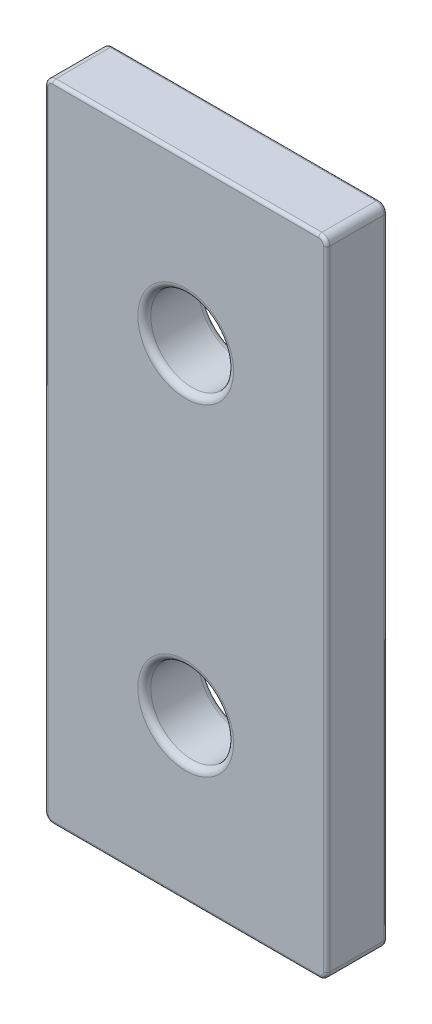
ISO-10303-21;
HEADER;
FILE_DESCRIPTION(('STEP AP214'),'2;1');
FILE_NAME('part.step','',(''),(''),'','','');
FILE_SCHEMA(('AUTOMOTIVE_DESIGN { 1 0 10303 214 1 1 1 1 }'));
ENDSEC;
DATA;
#1=APPLICATION_CONTEXT('core data for automotive mechanical design processes');
#2=APPLICATION_PROTOCOL_DEFINITION('international standard','automotive_design',2000,#1);
#3=PRODUCT_CONTEXT('',#1,'mechanical');
#4=PRODUCT('Part','Part','',(#3));
#5=PRODUCT_RELATED_PRODUCT_CATEGORY('part','',(#4));
#6=PRODUCT_DEFINITION_FORMATION('','',#4);
#7=PRODUCT_DEFINITION_CONTEXT('part definition',#1,'design');
#8=PRODUCT_DEFINITION('design','',#6,#7);
#9=PRODUCT_DEFINITION_SHAPE('','',#8);
#10=(LENGTH_UNIT() NAMED_UNIT(*) SI_UNIT(.MILLI.,.METRE.));
#11=(NAMED_UNIT(*) PLANE_ANGLE_UNIT() SI_UNIT($,.RADIAN.));
#12=(NAMED_UNIT(*) SI_UNIT($,.STERADIAN.) SOLID_ANGLE_UNIT());
#13=UNCERTAINTY_MEASURE_WITH_UNIT(LENGTH_MEASURE(1.E-05),#10,'distance_accuracy_value','');
#14=(GEOMETRIC_REPRESENTATION_CONTEXT(3) GLOBAL_UNCERTAINTY_ASSIGNED_CONTEXT((#13)) GLOBAL_UNIT_ASSIGNED_CONTEXT((#10,
#11,#12)) REPRESENTATION_CONTEXT('',''));
#15=CARTESIAN_POINT('',(0.,0.,0.));
#16=DIRECTION('',(0.,0.,1.));
#17=DIRECTION('',(1.,0.,0.));
#18=AXIS2_PLACEMENT_3D('',#15,#16,#17);
#19=CARTESIAN_POINT('',(-11.1125,25.4,2.3876));
#20=DIRECTION('',(0.,-1.,0.));
#21=DIRECTION('',(0.,0.,-1.));
#22=AXIS2_PLACEMENT_3D('',#19,#20,#21);
#23=PLANE('',#22);
#24=DIRECTION('',(0.,0.,-1.));
#25=VECTOR('',#24,1.);
#26=CARTESIAN_POINT('',(10.4775,25.4,2.3876));
#27=LINE('',#26,#25);
#28=CARTESIAN_POINT('',(10.4775,25.4,2.1336));
#29=VERTEX_POINT('',#28);
#30=CARTESIAN_POINT('',(10.4775,25.4,-2.1336));
#31=VERTEX_POINT('',#30);
#32=EDGE_CURVE('E190',#29,#31,#27,.T.);
#33=ORIENTED_EDGE('',*,*,#32,.T.);
#34=DIRECTION('',(-1.,0.,0.));
#35=VECTOR('',#34,1.);
#36=CARTESIAN_POINT('',(-10.4775,25.4,-2.1336));
#37=LINE('',#36,#35);
#38=CARTESIAN_POINT('',(-10.4775,25.4,-2.1336));
#39=VERTEX_POINT('',#38);
#40=EDGE_CURVE('E246',#31,#39,#37,.T.);
#41=ORIENTED_EDGE('',*,*,#40,.T.);
#42=DIRECTION('',(0.,0.,-1.));
#43=VECTOR('',#42,1.);
#44=CARTESIAN_POINT('',(-10.4775,25.4,2.3876));
#45=LINE('',#44,#43);
#46=CARTESIAN_POINT('',(-10.4775,25.4,2.1336));
#47=VERTEX_POINT('',#46);
#48=EDGE_CURVE('E185',#39,#47,#45,.F.);
#49=ORIENTED_EDGE('',*,*,#48,.T.);
#50=DIRECTION('',(-1.,0.,0.));
#51=VECTOR('',#50,1.);
#52=CARTESIAN_POINT('',(-11.1125,25.4,2.1336));
#53=LINE('',#52,#51);
#54=EDGE_CURVE('E243',#47,#29,#53,.F.);
#55=ORIENTED_EDGE('',*,*,#54,.T.);
#56=EDGE_LOOP('',(#33,#41,#49,#55));
#57=FACE_BOUND('',#56,.T.);
#58=ADVANCED_FACE('F43',(#57),#23,.F.);
#59=CARTESIAN_POINT('',(-11.1125,25.4,2.3876));
#60=DIRECTION('',(1.,0.,0.));
#61=DIRECTION('',(0.,0.,-1.));
#62=AXIS2_PLACEMENT_3D('',#59,#60,#61);
#63=PLANE('',#62);
#64=DIRECTION('',(0.,0.,-1.));
#65=VECTOR('',#64,1.);
#66=CARTESIAN_POINT('',(-11.1125,24.765,2.3876));
#67=LINE('',#66,#65);
#68=CARTESIAN_POINT('',(-11.1125,24.765,2.1336));
#69=VERTEX_POINT('',#68);
#70=CARTESIAN_POINT('',(-11.1125,24.765,-2.1336));
#71=VERTEX_POINT('',#70);
#72=EDGE_CURVE('E532',#69,#71,#67,.T.);
#73=ORIENTED_EDGE('',*,*,#72,.T.);
#74=DIRECTION('',(0.,-1.,0.));
#75=VECTOR('',#74,1.);
#76=CARTESIAN_POINT('',(-11.1125,-24.765,-2.1336));
#77=LINE('',#76,#75);
#78=CARTESIAN_POINT('',(-11.1125,-24.765,-2.1336));
#79=VERTEX_POINT('',#78);
#80=EDGE_CURVE('E234',#71,#79,#77,.T.);
#81=ORIENTED_EDGE('',*,*,#80,.T.);
#82=DIRECTION('',(0.,0.,-1.));
#83=VECTOR('',#82,1.);
#84=CARTESIAN_POINT('',(-11.1125,-24.765,2.3876));
#85=LINE('',#84,#83);
#86=CARTESIAN_POINT('',(-11.1125,-24.765,2.1336));
#87=VERTEX_POINT('',#86);
#88=EDGE_CURVE('E536',#79,#87,#85,.F.);
#89=ORIENTED_EDGE('',*,*,#88,.T.);
#90=DIRECTION('',(0.,-1.,0.));
#91=VECTOR('',#90,1.);
#92=CARTESIAN_POINT('',(-11.1125,25.4,2.1336));
#93=LINE('',#92,#91);
#94=EDGE_CURVE('E231',#87,#69,#93,.F.);
#95=ORIENTED_EDGE('',*,*,#94,.T.);
#96=EDGE_LOOP('',(#73,#81,#89,#95));
#97=FACE_BOUND('',#96,.T.);
#98=ADVANCED_FACE('F387',(#97),#63,.F.);
#99=CARTESIAN_POINT('',(-11.1125,-25.4,2.3876));
#100=DIRECTION('',(0.,1.,0.));
#101=DIRECTION('',(0.,0.,1.));
#102=AXIS2_PLACEMENT_3D('',#99,#100,#101);
#103=PLANE('',#102);
#104=DIRECTION('',(0.,0.,-1.));
#105=VECTOR('',#104,1.);
#106=CARTESIAN_POINT('',(-10.4775,-25.4,2.3876));
#107=LINE('',#106,#105);
#108=CARTESIAN_POINT('',(-10.4775,-25.4,2.1336));
#109=VERTEX_POINT('',#108);
#110=CARTESIAN_POINT('',(-10.4775,-25.4,-2.1336));
#111=VERTEX_POINT('',#110);
#112=EDGE_CURVE('E502',#109,#111,#107,.T.);
#113=ORIENTED_EDGE('',*,*,#112,.T.);
#114=DIRECTION('',(1.,0.,0.));
#115=VECTOR('',#114,1.);
#116=CARTESIAN_POINT('',(10.4775,-25.4,-2.1336));
#117=LINE('',#116,#115);
#118=CARTESIAN_POINT('',(10.4775,-25.4,-2.1336));
#119=VERTEX_POINT('',#118);
#120=EDGE_CURVE('E222',#111,#119,#117,.T.);
#121=ORIENTED_EDGE('',*,*,#120,.T.);
#122=DIRECTION('',(0.,0.,-1.));
#123=VECTOR('',#122,1.);
#124=CARTESIAN_POINT('',(10.4775,-25.4,2.3876));
#125=LINE('',#124,#123);
#126=CARTESIAN_POINT('',(10.4775,-25.4,2.1336));
#127=VERTEX_POINT('',#126);
#128=EDGE_CURVE('E510',#119,#127,#125,.F.);
#129=ORIENTED_EDGE('',*,*,#128,.T.);
#130=DIRECTION('',(1.,0.,0.));
#131=VECTOR('',#130,1.);
#132=CARTESIAN_POINT('',(-11.1125,-25.4,2.1336));
#133=LINE('',#132,#131);
#134=EDGE_CURVE('E219',#127,#109,#133,.F.);
#135=ORIENTED_EDGE('',*,*,#134,.T.);
#136=EDGE_LOOP('',(#113,#121,#129,#135));
#137=FACE_BOUND('',#136,.T.);
#138=ADVANCED_FACE('F393',(#137),#103,.F.);
#139=CARTESIAN_POINT('',(11.1125,25.4,2.3876));
#140=DIRECTION('',(-1.,0.,0.));
#141=DIRECTION('',(0.,0.,1.));
#142=AXIS2_PLACEMENT_3D('',#139,#140,#141);
#143=PLANE('',#142);
#144=DIRECTION('',(0.,0.,-1.));
#145=VECTOR('',#144,1.);
#146=CARTESIAN_POINT('',(11.1125,-24.765,2.3876));
#147=LINE('',#146,#145);
#148=CARTESIAN_POINT('',(11.1125,-24.765,2.1336));
#149=VERTEX_POINT('',#148);
#150=CARTESIAN_POINT('',(11.1125,-24.765,-2.1336));
#151=VERTEX_POINT('',#150);
#152=EDGE_CURVE('E511',#149,#151,#147,.T.);
#153=ORIENTED_EDGE('',*,*,#152,.T.);
#154=DIRECTION('',(0.,1.,0.));
#155=VECTOR('',#154,1.);
#156=CARTESIAN_POINT('',(11.1125,24.765,-2.1336));
#157=LINE('',#156,#155);
#158=CARTESIAN_POINT('',(11.1125,24.765,-2.1336));
#159=VERTEX_POINT('',#158);
#160=EDGE_CURVE('E279',#151,#159,#157,.T.);
#161=ORIENTED_EDGE('',*,*,#160,.T.);
#162=DIRECTION('',(0.,0.,-1.));
#163=VECTOR('',#162,1.);
#164=CARTESIAN_POINT('',(11.1125,24.765,2.3876));
#165=LINE('',#164,#163);
#166=CARTESIAN_POINT('',(11.1125,24.765,2.1336));
#167=VERTEX_POINT('',#166);
#168=EDGE_CURVE('E306',#159,#167,#165,.F.);
#169=ORIENTED_EDGE('',*,*,#168,.T.);
#170=DIRECTION('',(0.,1.,0.));
#171=VECTOR('',#170,1.);
#172=CARTESIAN_POINT('',(11.1125,25.4,2.1336));
#173=LINE('',#172,#171);
#174=EDGE_CURVE('E276',#167,#149,#173,.F.);
#175=ORIENTED_EDGE('',*,*,#174,.T.);
#176=EDGE_LOOP('',(#153,#161,#169,#175));
#177=FACE_BOUND('',#176,.T.);
#178=ADVANCED_FACE('F486',(#177),#143,.F.);
#179=CARTESIAN_POINT('',(0.,0.,2.3876));
#180=DIRECTION('',(0.,0.,-1.));
#181=DIRECTION('',(-1.,0.,0.));
#182=AXIS2_PLACEMENT_3D('',#179,#180,#181);
#183=PLANE('',#182);
#184=CARTESIAN_POINT('',(0.,12.7,2.3876));
#185=DIRECTION('',(0.,0.,-1.));
#186=DIRECTION('',(-1.,0.,0.));
#187=AXIS2_PLACEMENT_3D('',#184,#185,#186);
#188=CIRCLE('',#187,3.7719);
#189=CARTESIAN_POINT('',(-3.7719,12.7,2.3876));
#190=VERTEX_POINT('',#189);
#191=EDGE_CURVE('E11',#190,#190,#188,.T.);
#192=ORIENTED_EDGE('',*,*,#191,.T.);
#193=EDGE_LOOP('',(#192));
#194=FACE_BOUND('',#193,.T.);
#195=CARTESIAN_POINT('',(0.,-12.7,2.3876));
#196=DIRECTION('',(0.,0.,-1.));
#197=DIRECTION('',(-1.,0.,0.));
#198=AXIS2_PLACEMENT_3D('',#195,#196,#197);
#199=CIRCLE('',#198,3.7719);
#200=CARTESIAN_POINT('',(-3.7719,-12.7,2.3876));
#201=VERTEX_POINT('',#200);
#202=EDGE_CURVE('E52',#201,#201,#199,.T.);
#203=ORIENTED_EDGE('',*,*,#202,.T.);
#204=EDGE_LOOP('',(#203));
#205=FACE_BOUND('',#204,.T.);
#206=DIRECTION('',(1.,0.,0.));
#207=VECTOR('',#206,1.);
#208=CARTESIAN_POINT('',(0.,-25.146,2.3876));
#209=LINE('',#208,#207);
#210=CARTESIAN_POINT('',(-10.4775,-25.146,2.3876));
#211=VERTEX_POINT('',#210);
#212=CARTESIAN_POINT('',(10.4775,-25.146,2.3876));
#213=VERTEX_POINT('',#212);
#214=EDGE_CURVE('E59',#211,#213,#209,.T.);
#215=ORIENTED_EDGE('',*,*,#214,.T.);
#216=CARTESIAN_POINT('',(10.4775,-24.765,2.3876));
#217=DIRECTION('',(0.,0.,-1.));
#218=DIRECTION('',(-1.,0.,0.));
#219=AXIS2_PLACEMENT_3D('',#216,#217,#218);
#220=CIRCLE('',#219,0.381);
#221=CARTESIAN_POINT('',(10.8585,-24.765,2.3876));
#222=VERTEX_POINT('',#221);
#223=EDGE_CURVE('E273',#213,#222,#220,.F.);
#224=ORIENTED_EDGE('',*,*,#223,.T.);
#225=DIRECTION('',(0.,1.,0.));
#226=VECTOR('',#225,1.);
#227=CARTESIAN_POINT('',(10.8585,0.,2.3876));
#228=LINE('',#227,#226);
#229=CARTESIAN_POINT('',(10.8585,24.765,2.3876));
#230=VERTEX_POINT('',#229);
#231=EDGE_CURVE('E254',#222,#230,#228,.T.);
#232=ORIENTED_EDGE('',*,*,#231,.T.);
#233=CARTESIAN_POINT('',(10.4775,24.765,2.3876));
#234=DIRECTION('',(0.,0.,-1.));
#235=DIRECTION('',(-1.,0.,0.));
#236=AXIS2_PLACEMENT_3D('',#233,#234,#235);
#237=CIRCLE('',#236,0.381);
#238=CARTESIAN_POINT('',(10.4775,25.146,2.3876));
#239=VERTEX_POINT('',#238);
#240=EDGE_CURVE('E257',#230,#239,#237,.F.);
#241=ORIENTED_EDGE('',*,*,#240,.T.);
#242=DIRECTION('',(-1.,0.,0.));
#243=VECTOR('',#242,1.);
#244=CARTESIAN_POINT('',(0.,25.146,2.3876));
#245=LINE('',#244,#243);
#246=CARTESIAN_POINT('',(-10.4775,25.146,2.3876));
#247=VERTEX_POINT('',#246);
#248=EDGE_CURVE('E260',#239,#247,#245,.T.);
#249=ORIENTED_EDGE('',*,*,#248,.T.);
#250=CARTESIAN_POINT('',(-10.4775,24.765,2.3876));
#251=DIRECTION('',(0.,0.,-1.));
#252=DIRECTION('',(-1.,0.,0.));
#253=AXIS2_PLACEMENT_3D('',#250,#251,#252);
#254=CIRCLE('',#253,0.381);
#255=CARTESIAN_POINT('',(-10.8585,24.765,2.3876));
#256=VERTEX_POINT('',#255);
#257=EDGE_CURVE('E263',#247,#256,#254,.F.);
#258=ORIENTED_EDGE('',*,*,#257,.T.);
#259=DIRECTION('',(0.,-1.,0.));
#260=VECTOR('',#259,1.);
#261=CARTESIAN_POINT('',(-10.8585,0.,2.3876));
#262=LINE('',#261,#260);
#263=CARTESIAN_POINT('',(-10.8585,-24.765,2.3876));
#264=VERTEX_POINT('',#263);
#265=EDGE_CURVE('E266',#256,#264,#262,.T.);
#266=ORIENTED_EDGE('',*,*,#265,.T.);
#267=CARTESIAN_POINT('',(-10.4775,-24.765,2.3876));
#268=DIRECTION('',(0.,0.,-1.));
#269=DIRECTION('',(-1.,0.,0.));
#270=AXIS2_PLACEMENT_3D('',#267,#268,#269);
#271=CIRCLE('',#270,0.381);
#272=EDGE_CURVE('E64',#264,#211,#271,.F.);
#273=ORIENTED_EDGE('',*,*,#272,.T.);
#274=EDGE_LOOP('',(#215,#224,#232,#241,#249,#258,#266,#273));
#275=FACE_BOUND('',#274,.T.);
#276=ADVANCED_FACE('F363',(#194,#205,#275),#183,.F.);
#277=CARTESIAN_POINT('',(0.,0.,-2.3876));
#278=DIRECTION('',(0.,0.,-1.));
#279=DIRECTION('',(-1.,0.,0.));
#280=AXIS2_PLACEMENT_3D('',#277,#278,#279);
#281=PLANE('',#280);
#282=CARTESIAN_POINT('',(0.,12.7,-2.3876));
#283=DIRECTION('',(0.,0.,-1.));
#284=DIRECTION('',(-1.,0.,0.));
#285=AXIS2_PLACEMENT_3D('',#282,#283,#284);
#286=CIRCLE('',#285,3.7719);
#287=CARTESIAN_POINT('',(-3.7719,12.7,-2.3876));
#288=VERTEX_POINT('',#287);
#289=EDGE_CURVE('E339',#288,#288,#286,.F.);
#290=ORIENTED_EDGE('',*,*,#289,.T.);
#291=EDGE_LOOP('',(#290));
#292=FACE_BOUND('',#291,.T.);
#293=CARTESIAN_POINT('',(0.,-12.7,-2.3876));
#294=DIRECTION('',(0.,0.,-1.));
#295=DIRECTION('',(-1.,0.,0.));
#296=AXIS2_PLACEMENT_3D('',#293,#294,#295);
#297=CIRCLE('',#296,3.7719);
#298=CARTESIAN_POINT('',(-3.7719,-12.7,-2.3876));
#299=VERTEX_POINT('',#298);
#300=EDGE_CURVE('E282',#299,#299,#297,.F.);
#301=ORIENTED_EDGE('',*,*,#300,.T.);
#302=EDGE_LOOP('',(#301));
#303=FACE_BOUND('',#302,.T.);
#304=DIRECTION('',(0.,1.,0.));
#305=VECTOR('',#304,1.);
#306=CARTESIAN_POINT('',(10.8585,-24.765,-2.3876));
#307=LINE('',#306,#305);
#308=CARTESIAN_POINT('',(10.8585,24.765,-2.3876));
#309=VERTEX_POINT('',#308);
#310=CARTESIAN_POINT('',(10.8585,-24.765,-2.3876));
#311=VERTEX_POINT('',#310);
#312=EDGE_CURVE('E161',#309,#311,#307,.F.);
#313=ORIENTED_EDGE('',*,*,#312,.T.);
#314=CARTESIAN_POINT('',(10.4775,-24.765,-2.3876));
#315=DIRECTION('',(0.,0.,-1.));
#316=DIRECTION('',(-1.,0.,0.));
#317=AXIS2_PLACEMENT_3D('',#314,#315,#316);
#318=CIRCLE('',#317,0.381);
#319=CARTESIAN_POINT('',(10.4775,-25.146,-2.3876));
#320=VERTEX_POINT('',#319);
#321=EDGE_CURVE('E208',#311,#320,#318,.T.);
#322=ORIENTED_EDGE('',*,*,#321,.T.);
#323=DIRECTION('',(1.,0.,0.));
#324=VECTOR('',#323,1.);
#325=CARTESIAN_POINT('',(-10.4775,-25.146,-2.3876));
#326=LINE('',#325,#324);
#327=CARTESIAN_POINT('',(-10.4775,-25.146,-2.3876));
#328=VERTEX_POINT('',#327);
#329=EDGE_CURVE('E205',#320,#328,#326,.F.);
#330=ORIENTED_EDGE('',*,*,#329,.T.);
#331=CARTESIAN_POINT('',(-10.4775,-24.765,-2.3876));
#332=DIRECTION('',(0.,0.,-1.));
#333=DIRECTION('',(-1.,0.,0.));
#334=AXIS2_PLACEMENT_3D('',#331,#332,#333);
#335=CIRCLE('',#334,0.381);
#336=CARTESIAN_POINT('',(-10.8585,-24.765,-2.3876));
#337=VERTEX_POINT('',#336);
#338=EDGE_CURVE('E202',#328,#337,#335,.T.);
#339=ORIENTED_EDGE('',*,*,#338,.T.);
#340=DIRECTION('',(0.,-1.,0.));
#341=VECTOR('',#340,1.);
#342=CARTESIAN_POINT('',(-10.8585,24.765,-2.3876));
#343=LINE('',#342,#341);
#344=CARTESIAN_POINT('',(-10.8585,24.765,-2.3876));
#345=VERTEX_POINT('',#344);
#346=EDGE_CURVE('E199',#337,#345,#343,.F.);
#347=ORIENTED_EDGE('',*,*,#346,.T.);
#348=CARTESIAN_POINT('',(-10.4775,24.765,-2.3876));
#349=DIRECTION('',(0.,0.,-1.));
#350=DIRECTION('',(-1.,0.,0.));
#351=AXIS2_PLACEMENT_3D('',#348,#349,#350);
#352=CIRCLE('',#351,0.381);
#353=CARTESIAN_POINT('',(-10.4775,25.146,-2.3876));
#354=VERTEX_POINT('',#353);
#355=EDGE_CURVE('E196',#345,#354,#352,.T.);
#356=ORIENTED_EDGE('',*,*,#355,.T.);
#357=DIRECTION('',(-1.,0.,0.));
#358=VECTOR('',#357,1.);
#359=CARTESIAN_POINT('',(10.4775,25.146,-2.3876));
#360=LINE('',#359,#358);
#361=CARTESIAN_POINT('',(10.4775,25.146,-2.3876));
#362=VERTEX_POINT('',#361);
#363=EDGE_CURVE('E164',#354,#362,#360,.F.);
#364=ORIENTED_EDGE('',*,*,#363,.T.);
#365=CARTESIAN_POINT('',(10.4775,24.765,-2.3876));
#366=DIRECTION('',(0.,0.,-1.));
#367=DIRECTION('',(-1.,0.,0.));
#368=AXIS2_PLACEMENT_3D('',#365,#366,#367);
#369=CIRCLE('',#368,0.381);
#370=EDGE_CURVE('E156',#362,#309,#369,.T.);
#371=ORIENTED_EDGE('',*,*,#370,.T.);
#372=EDGE_LOOP('',(#313,#322,#330,#339,#347,#356,#364,#371));
#373=FACE_BOUND('',#372,.T.);
#374=ADVANCED_FACE('F158',(#292,#303,#373),#281,.T.);
#375=CARTESIAN_POINT('',(10.4775,-24.765,2.3876));
#376=DIRECTION('',(0.,0.,-1.));
#377=DIRECTION('',(-1.,0.,0.));
#378=AXIS2_PLACEMENT_3D('',#375,#376,#377);
#379=CYLINDRICAL_SURFACE('',#378,0.635);
#380=ORIENTED_EDGE('',*,*,#128,.F.);
#381=CARTESIAN_POINT('',(10.4775,-24.765,-2.1336));
#382=DIRECTION('',(0.,0.,-1.));
#383=DIRECTION('',(-1.,0.,0.));
#384=AXIS2_PLACEMENT_3D('',#381,#382,#383);
#385=CIRCLE('',#384,0.635);
#386=EDGE_CURVE('E215',#119,#151,#385,.F.);
#387=ORIENTED_EDGE('',*,*,#386,.T.);
#388=ORIENTED_EDGE('',*,*,#152,.F.);
#389=CARTESIAN_POINT('',(10.4775,-24.765,2.1336));
#390=DIRECTION('',(0.,0.,-1.));
#391=DIRECTION('',(-1.,0.,0.));
#392=AXIS2_PLACEMENT_3D('',#389,#390,#391);
#393=CIRCLE('',#392,0.635);
#394=EDGE_CURVE('E211',#149,#127,#393,.T.);
#395=ORIENTED_EDGE('',*,*,#394,.T.);
#396=EDGE_LOOP('',(#380,#387,#388,#395));
#397=FACE_BOUND('',#396,.T.);
#398=ADVANCED_FACE('F399',(#397),#379,.T.);
#399=CARTESIAN_POINT('',(-10.4775,-24.765,2.3876));
#400=DIRECTION('',(0.,0.,-1.));
#401=DIRECTION('',(-1.,0.,0.));
#402=AXIS2_PLACEMENT_3D('',#399,#400,#401);
#403=CYLINDRICAL_SURFACE('',#402,0.635);
#404=ORIENTED_EDGE('',*,*,#88,.F.);
#405=CARTESIAN_POINT('',(-10.4775,-24.765,-2.1336));
#406=DIRECTION('',(0.,0.,-1.));
#407=DIRECTION('',(-1.,0.,0.));
#408=AXIS2_PLACEMENT_3D('',#405,#406,#407);
#409=CIRCLE('',#408,0.635);
#410=EDGE_CURVE('E228',#79,#111,#409,.F.);
#411=ORIENTED_EDGE('',*,*,#410,.T.);
#412=ORIENTED_EDGE('',*,*,#112,.F.);
#413=CARTESIAN_POINT('',(-10.4775,-24.765,2.1336));
#414=DIRECTION('',(0.,0.,-1.));
#415=DIRECTION('',(-1.,0.,0.));
#416=AXIS2_PLACEMENT_3D('',#413,#414,#415);
#417=CIRCLE('',#416,0.635);
#418=EDGE_CURVE('E225',#109,#87,#417,.T.);
#419=ORIENTED_EDGE('',*,*,#418,.T.);
#420=EDGE_LOOP('',(#404,#411,#412,#419));
#421=FACE_BOUND('',#420,.T.);
#422=ADVANCED_FACE('F402',(#421),#403,.T.);
#423=CARTESIAN_POINT('',(-10.4775,24.765,2.3876));
#424=DIRECTION('',(0.,0.,-1.));
#425=DIRECTION('',(-1.,0.,0.));
#426=AXIS2_PLACEMENT_3D('',#423,#424,#425);
#427=CYLINDRICAL_SURFACE('',#426,0.635);
#428=ORIENTED_EDGE('',*,*,#48,.F.);
#429=CARTESIAN_POINT('',(-10.4775,24.765,-2.1336));
#430=DIRECTION('',(0.,0.,-1.));
#431=DIRECTION('',(-1.,0.,0.));
#432=AXIS2_PLACEMENT_3D('',#429,#430,#431);
#433=CIRCLE('',#432,0.635);
#434=EDGE_CURVE('E240',#39,#71,#433,.F.);
#435=ORIENTED_EDGE('',*,*,#434,.T.);
#436=ORIENTED_EDGE('',*,*,#72,.F.);
#437=CARTESIAN_POINT('',(-10.4775,24.765,2.1336));
#438=DIRECTION('',(0.,0.,-1.));
#439=DIRECTION('',(-1.,0.,0.));
#440=AXIS2_PLACEMENT_3D('',#437,#438,#439);
#441=CIRCLE('',#440,0.635);
#442=EDGE_CURVE('E237',#69,#47,#441,.T.);
#443=ORIENTED_EDGE('',*,*,#442,.T.);
#444=EDGE_LOOP('',(#428,#435,#436,#443));
#445=FACE_BOUND('',#444,.T.);
#446=ADVANCED_FACE('F406',(#445),#427,.T.);
#447=CARTESIAN_POINT('',(10.4775,24.765,2.3876));
#448=DIRECTION('',(0.,0.,-1.));
#449=DIRECTION('',(-1.,0.,0.));
#450=AXIS2_PLACEMENT_3D('',#447,#448,#449);
#451=CYLINDRICAL_SURFACE('',#450,0.635);
#452=ORIENTED_EDGE('',*,*,#168,.F.);
#453=CARTESIAN_POINT('',(10.4775,24.765,-2.1336));
#454=DIRECTION('',(0.,0.,-1.));
#455=DIRECTION('',(-1.,0.,0.));
#456=AXIS2_PLACEMENT_3D('',#453,#454,#455);
#457=CIRCLE('',#456,0.635);
#458=EDGE_CURVE('E174',#159,#31,#457,.F.);
#459=ORIENTED_EDGE('',*,*,#458,.T.);
#460=ORIENTED_EDGE('',*,*,#32,.F.);
#461=CARTESIAN_POINT('',(10.4775,24.765,2.1336));
#462=DIRECTION('',(0.,0.,-1.));
#463=DIRECTION('',(-1.,0.,0.));
#464=AXIS2_PLACEMENT_3D('',#461,#462,#463);
#465=CIRCLE('',#464,0.635);
#466=EDGE_CURVE('E249',#29,#167,#465,.T.);
#467=ORIENTED_EDGE('',*,*,#466,.T.);
#468=EDGE_LOOP('',(#452,#459,#460,#467));
#469=FACE_BOUND('',#468,.T.);
#470=ADVANCED_FACE('F383',(#469),#451,.T.);
#471=CARTESIAN_POINT('',(0.,12.7,-2.3876));
#472=DIRECTION('',(0.,0.,1.));
#473=DIRECTION('',(1.,0.,0.));
#474=AXIS2_PLACEMENT_3D('',#471,#472,#473);
#475=CYLINDRICAL_SURFACE('',#474,3.2639);
#476=CARTESIAN_POINT('',(0.,12.7,-1.8796));
#477=DIRECTION('',(0.,0.,-1.));
#478=DIRECTION('',(-1.,0.,0.));
#479=AXIS2_PLACEMENT_3D('',#476,#477,#478);
#480=CIRCLE('',#479,3.2639);
#481=CARTESIAN_POINT('',(-3.2639,12.7,-1.8796));
#482=VERTEX_POINT('',#481);
#483=EDGE_CURVE('E347',#482,#482,#480,.T.);
#484=ORIENTED_EDGE('',*,*,#483,.T.);
#485=EDGE_LOOP('',(#484));
#486=FACE_BOUND('',#485,.T.);
#487=CARTESIAN_POINT('',(0.,12.7,1.8796));
#488=DIRECTION('',(0.,0.,-1.));
#489=DIRECTION('',(-1.,0.,0.));
#490=AXIS2_PLACEMENT_3D('',#487,#488,#489);
#491=CIRCLE('',#490,3.2639);
#492=CARTESIAN_POINT('',(-3.2639,12.7,1.8796));
#493=VERTEX_POINT('',#492);
#494=EDGE_CURVE('E343',#493,#493,#491,.F.);
#495=ORIENTED_EDGE('',*,*,#494,.T.);
#496=EDGE_LOOP('',(#495));
#497=FACE_BOUND('',#496,.T.);
#498=ADVANCED_FACE('F373',(#486,#497),#475,.F.);
#499=CARTESIAN_POINT('',(0.,-12.7,-2.3876));
#500=DIRECTION('',(0.,0.,1.));
#501=DIRECTION('',(1.,0.,0.));
#502=AXIS2_PLACEMENT_3D('',#499,#500,#501);
#503=CYLINDRICAL_SURFACE('',#502,3.2639);
#504=CARTESIAN_POINT('',(0.,-12.7,-1.8796));
#505=DIRECTION('',(0.,0.,-1.));
#506=DIRECTION('',(-1.,0.,0.));
#507=AXIS2_PLACEMENT_3D('',#504,#505,#506);
#508=CIRCLE('',#507,3.2639);
#509=CARTESIAN_POINT('',(-3.2639,-12.7,-1.8796));
#510=VERTEX_POINT('',#509);
#511=EDGE_CURVE('E355',#510,#510,#508,.T.);
#512=ORIENTED_EDGE('',*,*,#511,.T.);
#513=EDGE_LOOP('',(#512));
#514=FACE_BOUND('',#513,.T.);
#515=CARTESIAN_POINT('',(0.,-12.7,1.8796));
#516=DIRECTION('',(0.,0.,-1.));
#517=DIRECTION('',(-1.,0.,0.));
#518=AXIS2_PLACEMENT_3D('',#515,#516,#517);
#519=CIRCLE('',#518,3.2639);
#520=CARTESIAN_POINT('',(-3.2639,-12.7,1.8796));
#521=VERTEX_POINT('',#520);
#522=EDGE_CURVE('E351',#521,#521,#519,.F.);
#523=ORIENTED_EDGE('',*,*,#522,.T.);
#524=EDGE_LOOP('',(#523));
#525=FACE_BOUND('',#524,.T.);
#526=ADVANCED_FACE('F370',(#514,#525),#503,.F.);
#527=CARTESIAN_POINT('',(-10.4775,24.765,-2.1336));
#528=DIRECTION('',(0.,0.,-1.));
#529=DIRECTION('',(-1.,0.,0.));
#530=AXIS2_PLACEMENT_3D('',#527,#528,#529);
#531=TOROIDAL_SURFACE('',#530,0.381,0.254);
#532=CARTESIAN_POINT('',(-10.8585,24.765,-2.1336));
#533=DIRECTION('',(0.,-1.,0.));
#534=DIRECTION('',(0.,0.,-1.));
#535=AXIS2_PLACEMENT_3D('',#532,#533,#534);
#536=CIRCLE('',#535,0.254);
#537=EDGE_CURVE('E298',#71,#345,#536,.T.);
#538=ORIENTED_EDGE('',*,*,#537,.F.);
#539=ORIENTED_EDGE('',*,*,#434,.F.);
#540=CARTESIAN_POINT('',(-10.4775,25.146,-2.1336));
#541=DIRECTION('',(1.,0.,0.));
#542=DIRECTION('',(0.,0.,-1.));
#543=AXIS2_PLACEMENT_3D('',#540,#541,#542);
#544=CIRCLE('',#543,0.254);
#545=EDGE_CURVE('E302',#354,#39,#544,.T.);
#546=ORIENTED_EDGE('',*,*,#545,.F.);
#547=ORIENTED_EDGE('',*,*,#355,.F.);
#548=EDGE_LOOP('',(#538,#539,#546,#547));
#549=FACE_BOUND('',#548,.T.);
#550=ADVANCED_FACE('F372',(#549),#531,.T.);
#551=CARTESIAN_POINT('',(-11.1125,25.146,-2.1336));
#552=DIRECTION('',(1.,0.,0.));
#553=DIRECTION('',(0.,0.,-1.));
#554=AXIS2_PLACEMENT_3D('',#551,#552,#553);
#555=CYLINDRICAL_SURFACE('',#554,0.254);
#556=ORIENTED_EDGE('',*,*,#545,.T.);
#557=ORIENTED_EDGE('',*,*,#40,.F.);
#558=CARTESIAN_POINT('',(10.4775,25.146,-2.1336));
#559=DIRECTION('',(1.,0.,0.));
#560=DIRECTION('',(0.,0.,-1.));
#561=AXIS2_PLACEMENT_3D('',#558,#559,#560);
#562=CIRCLE('',#561,0.254);
#563=EDGE_CURVE('E295',#362,#31,#562,.T.);
#564=ORIENTED_EDGE('',*,*,#563,.F.);
#565=ORIENTED_EDGE('',*,*,#363,.F.);
#566=EDGE_LOOP('',(#556,#557,#564,#565));
#567=FACE_BOUND('',#566,.T.);
#568=ADVANCED_FACE('F380',(#567),#555,.T.);
#569=CARTESIAN_POINT('',(-10.8585,25.4,-2.1336));
#570=DIRECTION('',(0.,1.,0.));
#571=DIRECTION('',(0.,0.,1.));
#572=AXIS2_PLACEMENT_3D('',#569,#570,#571);
#573=CYLINDRICAL_SURFACE('',#572,0.254);
#574=ORIENTED_EDGE('',*,*,#537,.T.);
#575=ORIENTED_EDGE('',*,*,#346,.F.);
#576=CARTESIAN_POINT('',(-10.8585,-24.765,-2.1336));
#577=DIRECTION('',(0.,-1.,0.));
#578=DIRECTION('',(0.,0.,-1.));
#579=AXIS2_PLACEMENT_3D('',#576,#577,#578);
#580=CIRCLE('',#579,0.254);
#581=EDGE_CURVE('E178',#79,#337,#580,.T.);
#582=ORIENTED_EDGE('',*,*,#581,.F.);
#583=ORIENTED_EDGE('',*,*,#80,.F.);
#584=EDGE_LOOP('',(#574,#575,#582,#583));
#585=FACE_BOUND('',#584,.T.);
#586=ADVANCED_FACE('F431',(#585),#573,.T.);
#587=CARTESIAN_POINT('',(10.4775,24.765,-2.1336));
#588=DIRECTION('',(0.,0.,-1.));
#589=DIRECTION('',(-1.,0.,0.));
#590=AXIS2_PLACEMENT_3D('',#587,#588,#589);
#591=TOROIDAL_SURFACE('',#590,0.381,0.254);
#592=ORIENTED_EDGE('',*,*,#563,.T.);
#593=ORIENTED_EDGE('',*,*,#458,.F.);
#594=CARTESIAN_POINT('',(10.8585,24.765,-2.1336));
#595=DIRECTION('',(0.,-1.,0.));
#596=DIRECTION('',(0.,0.,-1.));
#597=AXIS2_PLACEMENT_3D('',#594,#595,#596);
#598=CIRCLE('',#597,0.254);
#599=EDGE_CURVE('E172',#309,#159,#598,.T.);
#600=ORIENTED_EDGE('',*,*,#599,.F.);
#601=ORIENTED_EDGE('',*,*,#370,.F.);
#602=EDGE_LOOP('',(#592,#593,#600,#601));
#603=FACE_BOUND('',#602,.T.);
#604=ADVANCED_FACE('F173',(#603),#591,.T.);
#605=CARTESIAN_POINT('',(-10.4775,-24.765,-2.1336));
#606=DIRECTION('',(0.,0.,-1.));
#607=DIRECTION('',(-1.,0.,0.));
#608=AXIS2_PLACEMENT_3D('',#605,#606,#607);
#609=TOROIDAL_SURFACE('',#608,0.381,0.254);
#610=ORIENTED_EDGE('',*,*,#581,.T.);
#611=ORIENTED_EDGE('',*,*,#338,.F.);
#612=CARTESIAN_POINT('',(-10.4775,-25.146,-2.1336));
#613=DIRECTION('',(1.,0.,0.));
#614=DIRECTION('',(0.,0.,-1.));
#615=AXIS2_PLACEMENT_3D('',#612,#613,#614);
#616=CIRCLE('',#615,0.254);
#617=EDGE_CURVE('E179',#111,#328,#616,.T.);
#618=ORIENTED_EDGE('',*,*,#617,.F.);
#619=ORIENTED_EDGE('',*,*,#410,.F.);
#620=EDGE_LOOP('',(#610,#611,#618,#619));
#621=FACE_BOUND('',#620,.T.);
#622=ADVANCED_FACE('F425',(#621),#609,.T.);
#623=CARTESIAN_POINT('',(10.8585,25.4,-2.1336));
#624=DIRECTION('',(0.,-1.,0.));
#625=DIRECTION('',(0.,0.,-1.));
#626=AXIS2_PLACEMENT_3D('',#623,#624,#625);
#627=CYLINDRICAL_SURFACE('',#626,0.254);
#628=ORIENTED_EDGE('',*,*,#599,.T.);
#629=ORIENTED_EDGE('',*,*,#160,.F.);
#630=CARTESIAN_POINT('',(10.8585,-24.765,-2.1336));
#631=DIRECTION('',(0.,-1.,0.));
#632=DIRECTION('',(0.,0.,-1.));
#633=AXIS2_PLACEMENT_3D('',#630,#631,#632);
#634=CIRCLE('',#633,0.254);
#635=EDGE_CURVE('E182',#311,#151,#634,.T.);
#636=ORIENTED_EDGE('',*,*,#635,.F.);
#637=ORIENTED_EDGE('',*,*,#312,.F.);
#638=EDGE_LOOP('',(#628,#629,#636,#637));
#639=FACE_BOUND('',#638,.T.);
#640=ADVANCED_FACE('F181',(#639),#627,.T.);
#641=CARTESIAN_POINT('',(-11.1125,-25.146,-2.1336));
#642=DIRECTION('',(-1.,0.,0.));
#643=DIRECTION('',(0.,0.,1.));
#644=AXIS2_PLACEMENT_3D('',#641,#642,#643);
#645=CYLINDRICAL_SURFACE('',#644,0.254);
#646=ORIENTED_EDGE('',*,*,#617,.T.);
#647=ORIENTED_EDGE('',*,*,#329,.F.);
#648=CARTESIAN_POINT('',(10.4775,-25.146,-2.1336));
#649=DIRECTION('',(1.,0.,0.));
#650=DIRECTION('',(0.,0.,-1.));
#651=AXIS2_PLACEMENT_3D('',#648,#649,#650);
#652=CIRCLE('',#651,0.254);
#653=EDGE_CURVE('E283',#119,#320,#652,.T.);
#654=ORIENTED_EDGE('',*,*,#653,.F.);
#655=ORIENTED_EDGE('',*,*,#120,.F.);
#656=EDGE_LOOP('',(#646,#647,#654,#655));
#657=FACE_BOUND('',#656,.T.);
#658=ADVANCED_FACE('F418',(#657),#645,.T.);
#659=CARTESIAN_POINT('',(10.4775,-24.765,-2.1336));
#660=DIRECTION('',(0.,0.,-1.));
#661=DIRECTION('',(-1.,0.,0.));
#662=AXIS2_PLACEMENT_3D('',#659,#660,#661);
#663=TOROIDAL_SURFACE('',#662,0.381,0.254);
#664=ORIENTED_EDGE('',*,*,#635,.T.);
#665=ORIENTED_EDGE('',*,*,#386,.F.);
#666=ORIENTED_EDGE('',*,*,#653,.T.);
#667=ORIENTED_EDGE('',*,*,#321,.F.);
#668=EDGE_LOOP('',(#664,#665,#666,#667));
#669=FACE_BOUND('',#668,.T.);
#670=ADVANCED_FACE('F414',(#669),#663,.T.);
#671=CARTESIAN_POINT('',(-10.4775,24.765,2.1336));
#672=DIRECTION('',(0.,0.,-1.));
#673=DIRECTION('',(-1.,0.,0.));
#674=AXIS2_PLACEMENT_3D('',#671,#672,#673);
#675=TOROIDAL_SURFACE('',#674,0.381,0.254);
#676=CARTESIAN_POINT('',(-10.4775,25.146,2.1336));
#677=DIRECTION('',(1.,0.,0.));
#678=DIRECTION('',(0.,0.,-1.));
#679=AXIS2_PLACEMENT_3D('',#676,#677,#678);
#680=CIRCLE('',#679,0.254);
#681=EDGE_CURVE('E329',#47,#247,#680,.T.);
#682=ORIENTED_EDGE('',*,*,#681,.F.);
#683=ORIENTED_EDGE('',*,*,#442,.F.);
#684=CARTESIAN_POINT('',(-10.8585,24.765,2.1336));
#685=DIRECTION('',(0.,-1.,0.));
#686=DIRECTION('',(0.,0.,-1.));
#687=AXIS2_PLACEMENT_3D('',#684,#685,#686);
#688=CIRCLE('',#687,0.254);
#689=EDGE_CURVE('E286',#256,#69,#688,.T.);
#690=ORIENTED_EDGE('',*,*,#689,.F.);
#691=ORIENTED_EDGE('',*,*,#257,.F.);
#692=EDGE_LOOP('',(#682,#683,#690,#691));
#693=FACE_BOUND('',#692,.T.);
#694=ADVANCED_FACE('F417',(#693),#675,.T.);
#695=CARTESIAN_POINT('',(-10.8585,0.,2.1336));
#696=DIRECTION('',(0.,-1.,0.));
#697=DIRECTION('',(0.,0.,-1.));
#698=AXIS2_PLACEMENT_3D('',#695,#696,#697);
#699=CYLINDRICAL_SURFACE('',#698,0.254);
#700=ORIENTED_EDGE('',*,*,#689,.T.);
#701=ORIENTED_EDGE('',*,*,#94,.F.);
#702=CARTESIAN_POINT('',(-10.8585,-24.765,2.1336));
#703=DIRECTION('',(0.,-1.,0.));
#704=DIRECTION('',(0.,0.,-1.));
#705=AXIS2_PLACEMENT_3D('',#702,#703,#704);
#706=CIRCLE('',#705,0.254);
#707=EDGE_CURVE('E325',#264,#87,#706,.T.);
#708=ORIENTED_EDGE('',*,*,#707,.F.);
#709=ORIENTED_EDGE('',*,*,#265,.F.);
#710=EDGE_LOOP('',(#700,#701,#708,#709));
#711=FACE_BOUND('',#710,.T.);
#712=ADVANCED_FACE('F462',(#711),#699,.T.);
#713=CARTESIAN_POINT('',(0.,25.146,2.1336));
#714=DIRECTION('',(-1.,0.,0.));
#715=DIRECTION('',(0.,0.,1.));
#716=AXIS2_PLACEMENT_3D('',#713,#714,#715);
#717=CYLINDRICAL_SURFACE('',#716,0.254);
#718=ORIENTED_EDGE('',*,*,#681,.T.);
#719=ORIENTED_EDGE('',*,*,#248,.F.);
#720=CARTESIAN_POINT('',(10.4775,25.146,2.1336));
#721=DIRECTION('',(1.,0.,0.));
#722=DIRECTION('',(0.,0.,-1.));
#723=AXIS2_PLACEMENT_3D('',#720,#721,#722);
#724=CIRCLE('',#723,0.254);
#725=EDGE_CURVE('E321',#29,#239,#724,.T.);
#726=ORIENTED_EDGE('',*,*,#725,.F.);
#727=ORIENTED_EDGE('',*,*,#54,.F.);
#728=EDGE_LOOP('',(#718,#719,#726,#727));
#729=FACE_BOUND('',#728,.T.);
#730=ADVANCED_FACE('F458',(#729),#717,.T.);
#731=CARTESIAN_POINT('',(-10.4775,-24.765,2.1336));
#732=DIRECTION('',(0.,0.,-1.));
#733=DIRECTION('',(-1.,0.,0.));
#734=AXIS2_PLACEMENT_3D('',#731,#732,#733);
#735=TOROIDAL_SURFACE('',#734,0.381,0.254);
#736=ORIENTED_EDGE('',*,*,#707,.T.);
#737=ORIENTED_EDGE('',*,*,#418,.F.);
#738=CARTESIAN_POINT('',(-10.4775,-25.146,2.1336));
#739=DIRECTION('',(1.,0.,0.));
#740=DIRECTION('',(0.,0.,-1.));
#741=AXIS2_PLACEMENT_3D('',#738,#739,#740);
#742=CIRCLE('',#741,0.254);
#743=EDGE_CURVE('E317',#211,#109,#742,.T.);
#744=ORIENTED_EDGE('',*,*,#743,.F.);
#745=ORIENTED_EDGE('',*,*,#272,.F.);
#746=EDGE_LOOP('',(#736,#737,#744,#745));
#747=FACE_BOUND('',#746,.T.);
#748=ADVANCED_FACE('F454',(#747),#735,.T.);
#749=CARTESIAN_POINT('',(10.4775,24.765,2.1336));
#750=DIRECTION('',(0.,0.,-1.));
#751=DIRECTION('',(-1.,0.,0.));
#752=AXIS2_PLACEMENT_3D('',#749,#750,#751);
#753=TOROIDAL_SURFACE('',#752,0.381,0.254);
#754=ORIENTED_EDGE('',*,*,#725,.T.);
#755=ORIENTED_EDGE('',*,*,#240,.F.);
#756=CARTESIAN_POINT('',(10.8585,24.765,2.1336));
#757=DIRECTION('',(0.,-1.,0.));
#758=DIRECTION('',(0.,0.,-1.));
#759=AXIS2_PLACEMENT_3D('',#756,#757,#758);
#760=CIRCLE('',#759,0.254);
#761=EDGE_CURVE('E313',#167,#230,#760,.T.);
#762=ORIENTED_EDGE('',*,*,#761,.F.);
#763=ORIENTED_EDGE('',*,*,#466,.F.);
#764=EDGE_LOOP('',(#754,#755,#762,#763));
#765=FACE_BOUND('',#764,.T.);
#766=ADVANCED_FACE('F450',(#765),#753,.T.);
#767=CARTESIAN_POINT('',(0.,-25.146,2.1336));
#768=DIRECTION('',(1.,0.,0.));
#769=DIRECTION('',(0.,0.,-1.));
#770=AXIS2_PLACEMENT_3D('',#767,#768,#769);
#771=CYLINDRICAL_SURFACE('',#770,0.254);
#772=ORIENTED_EDGE('',*,*,#743,.T.);
#773=ORIENTED_EDGE('',*,*,#134,.F.);
#774=CARTESIAN_POINT('',(10.4775,-25.146,2.1336));
#775=DIRECTION('',(1.,0.,0.));
#776=DIRECTION('',(0.,0.,-1.));
#777=AXIS2_PLACEMENT_3D('',#774,#775,#776);
#778=CIRCLE('',#777,0.254);
#779=EDGE_CURVE('E310',#213,#127,#778,.T.);
#780=ORIENTED_EDGE('',*,*,#779,.F.);
#781=ORIENTED_EDGE('',*,*,#214,.F.);
#782=EDGE_LOOP('',(#772,#773,#780,#781));
#783=FACE_BOUND('',#782,.T.);
#784=ADVANCED_FACE('F446',(#783),#771,.T.);
#785=CARTESIAN_POINT('',(10.8585,0.,2.1336));
#786=DIRECTION('',(0.,1.,0.));
#787=DIRECTION('',(0.,0.,1.));
#788=AXIS2_PLACEMENT_3D('',#785,#786,#787);
#789=CYLINDRICAL_SURFACE('',#788,0.254);
#790=ORIENTED_EDGE('',*,*,#761,.T.);
#791=ORIENTED_EDGE('',*,*,#231,.F.);
#792=CARTESIAN_POINT('',(10.8585,-24.765,2.1336));
#793=DIRECTION('',(0.,-1.,0.));
#794=DIRECTION('',(0.,0.,-1.));
#795=AXIS2_PLACEMENT_3D('',#792,#793,#794);
#796=CIRCLE('',#795,0.254);
#797=EDGE_CURVE('E307',#149,#222,#796,.T.);
#798=ORIENTED_EDGE('',*,*,#797,.F.);
#799=ORIENTED_EDGE('',*,*,#174,.F.);
#800=EDGE_LOOP('',(#790,#791,#798,#799));
#801=FACE_BOUND('',#800,.T.);
#802=ADVANCED_FACE('F442',(#801),#789,.T.);
#803=CARTESIAN_POINT('',(10.4775,-24.765,2.1336));
#804=DIRECTION('',(0.,0.,-1.));
#805=DIRECTION('',(-1.,0.,0.));
#806=AXIS2_PLACEMENT_3D('',#803,#804,#805);
#807=TOROIDAL_SURFACE('',#806,0.381,0.254);
#808=ORIENTED_EDGE('',*,*,#779,.T.);
#809=ORIENTED_EDGE('',*,*,#394,.F.);
#810=ORIENTED_EDGE('',*,*,#797,.T.);
#811=ORIENTED_EDGE('',*,*,#223,.F.);
#812=EDGE_LOOP('',(#808,#809,#810,#811));
#813=FACE_BOUND('',#812,.T.);
#814=ADVANCED_FACE('F438',(#813),#807,.T.);
#815=CARTESIAN_POINT('',(0.,12.7,-1.8796));
#816=DIRECTION('',(0.,0.,-1.));
#817=DIRECTION('',(-1.,0.,0.));
#818=AXIS2_PLACEMENT_3D('',#815,#816,#817);
#819=TOROIDAL_SURFACE('',#818,3.7719,0.508);
#820=ORIENTED_EDGE('',*,*,#483,.F.);
#821=EDGE_LOOP('',(#820));
#822=FACE_BOUND('',#821,.T.);
#823=ORIENTED_EDGE('',*,*,#289,.F.);
#824=EDGE_LOOP('',(#823));
#825=FACE_BOUND('',#824,.T.);
#826=ADVANCED_FACE('F441',(#822,#825),#819,.T.);
#827=CARTESIAN_POINT('',(0.,-12.7,-1.8796));
#828=DIRECTION('',(0.,0.,-1.));
#829=DIRECTION('',(-1.,0.,0.));
#830=AXIS2_PLACEMENT_3D('',#827,#828,#829);
#831=TOROIDAL_SURFACE('',#830,3.7719,0.508);
#832=ORIENTED_EDGE('',*,*,#511,.F.);
#833=EDGE_LOOP('',(#832));
#834=FACE_BOUND('',#833,.T.);
#835=ORIENTED_EDGE('',*,*,#300,.F.);
#836=EDGE_LOOP('',(#835));
#837=FACE_BOUND('',#836,.T.);
#838=ADVANCED_FACE('F472',(#834,#837),#831,.T.);
#839=CARTESIAN_POINT('',(0.,12.7,1.8796));
#840=DIRECTION('',(0.,0.,-1.));
#841=DIRECTION('',(-1.,0.,0.));
#842=AXIS2_PLACEMENT_3D('',#839,#840,#841);
#843=TOROIDAL_SURFACE('',#842,3.7719,0.508);
#844=ORIENTED_EDGE('',*,*,#191,.F.);
#845=EDGE_LOOP('',(#844));
#846=FACE_BOUND('',#845,.T.);
#847=ORIENTED_EDGE('',*,*,#494,.F.);
#848=EDGE_LOOP('',(#847));
#849=FACE_BOUND('',#848,.T.);
#850=ADVANCED_FACE('F367',(#846,#849),#843,.T.);
#851=CARTESIAN_POINT('',(0.,-12.7,1.8796));
#852=DIRECTION('',(0.,0.,-1.));
#853=DIRECTION('',(-1.,0.,0.));
#854=AXIS2_PLACEMENT_3D('',#851,#852,#853);
#855=TOROIDAL_SURFACE('',#854,3.7719,0.508);
#856=ORIENTED_EDGE('',*,*,#202,.F.);
#857=EDGE_LOOP('',(#856));
#858=FACE_BOUND('',#857,.T.);
#859=ORIENTED_EDGE('',*,*,#522,.F.);
#860=EDGE_LOOP('',(#859));
#861=FACE_BOUND('',#860,.T.);
#862=ADVANCED_FACE('F45',(#858,#861),#855,.T.);
#863=CLOSED_SHELL('',(#58,#98,#138,#178,#276,#374,#398,#422,#446,#470,#498,#526,#550,#568,#586,
#604,#622,#640,#658,#670,#694,#712,#730,#748,#766,#784,#802,#814,#826,#838,#850,#862));
#864=MANIFOLD_SOLID_BREP('B2',#863);
#865=ADVANCED_BREP_SHAPE_REPRESENTATION('',(#18,#864),#14);
#866=SHAPE_DEFINITION_REPRESENTATION(#9,#865);
ENDSEC;
END-ISO-10303-21;
